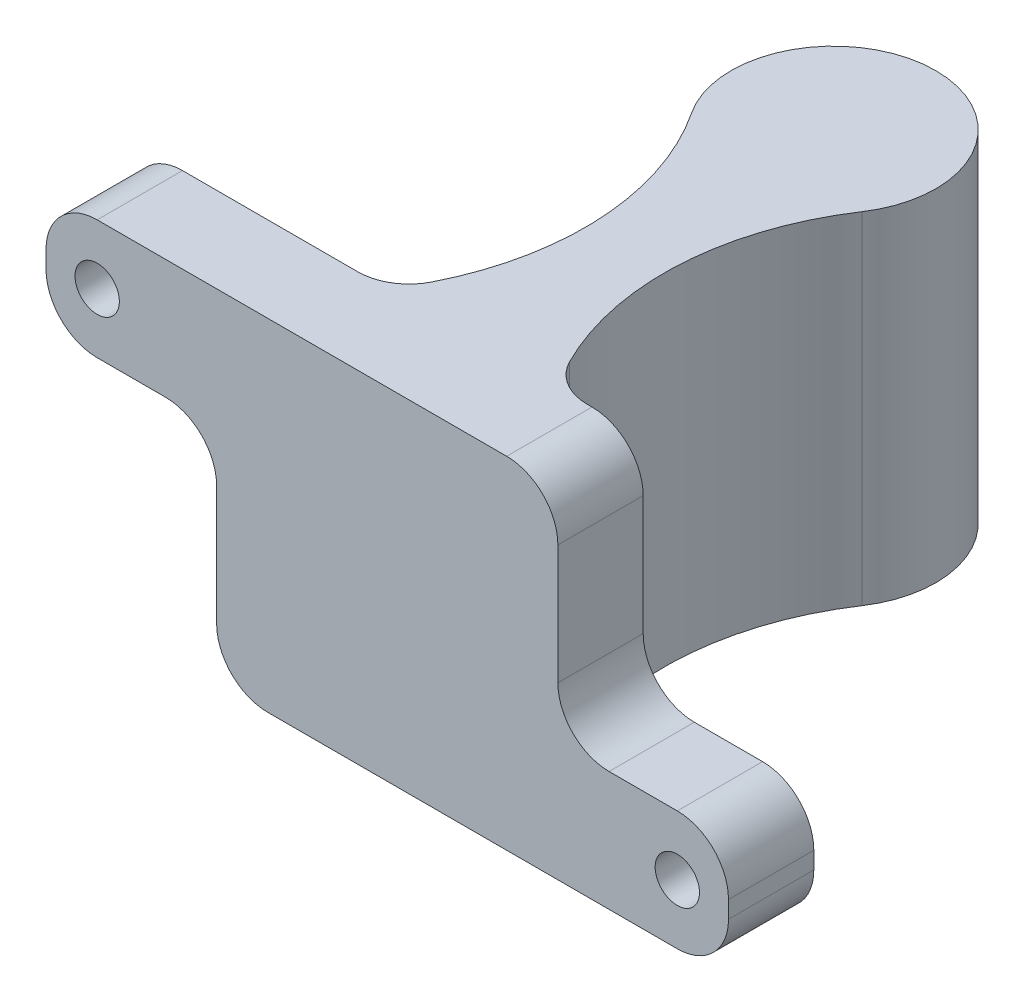
ISO-10303-21;
HEADER;
FILE_DESCRIPTION(('STEP AP214'),'2;1');
FILE_NAME('part.step','',(''),(''),'','','');
FILE_SCHEMA(('AUTOMOTIVE_DESIGN { 1 0 10303 214 1 1 1 1 }'));
ENDSEC;
DATA;
#1=APPLICATION_CONTEXT('core data for automotive mechanical design processes');
#2=APPLICATION_PROTOCOL_DEFINITION('international standard','automotive_design',2000,#1);
#3=PRODUCT_CONTEXT('',#1,'mechanical');
#4=PRODUCT('Part','Part','',(#3));
#5=PRODUCT_RELATED_PRODUCT_CATEGORY('part','',(#4));
#6=PRODUCT_DEFINITION_FORMATION('','',#4);
#7=PRODUCT_DEFINITION_CONTEXT('part definition',#1,'design');
#8=PRODUCT_DEFINITION('design','',#6,#7);
#9=PRODUCT_DEFINITION_SHAPE('','',#8);
#10=(LENGTH_UNIT() NAMED_UNIT(*) SI_UNIT(.MILLI.,.METRE.));
#11=(NAMED_UNIT(*) PLANE_ANGLE_UNIT() SI_UNIT($,.RADIAN.));
#12=(NAMED_UNIT(*) SI_UNIT($,.STERADIAN.) SOLID_ANGLE_UNIT());
#13=UNCERTAINTY_MEASURE_WITH_UNIT(LENGTH_MEASURE(1.E-05),#10,'distance_accuracy_value','');
#14=(GEOMETRIC_REPRESENTATION_CONTEXT(3) GLOBAL_UNCERTAINTY_ASSIGNED_CONTEXT((#13)) GLOBAL_UNIT_ASSIGNED_CONTEXT((#10,
#11,#12)) REPRESENTATION_CONTEXT('',''));
#15=CARTESIAN_POINT('',(0.,0.,0.));
#16=DIRECTION('',(0.,0.,1.));
#17=DIRECTION('',(1.,0.,0.));
#18=AXIS2_PLACEMENT_3D('',#15,#16,#17);
#19=CARTESIAN_POINT('',(0.,5.,0.));
#20=DIRECTION('',(1.,0.,0.));
#21=DIRECTION('',(0.,0.,-1.));
#22=AXIS2_PLACEMENT_3D('',#19,#20,#21);
#23=PLANE('',#22);
#24=DIRECTION('',(0.,-1.,0.));
#25=VECTOR('',#24,1.);
#26=CARTESIAN_POINT('',(0.,25.,-5.));
#27=LINE('',#26,#25);
#28=CARTESIAN_POINT('',(0.,15.,-5.));
#29=VERTEX_POINT('',#28);
#30=CARTESIAN_POINT('',(0.,8.,-5.));
#31=VERTEX_POINT('',#30);
#32=EDGE_CURVE('E235',#29,#31,#27,.T.);
#33=ORIENTED_EDGE('',*,*,#32,.T.);
#34=DIRECTION('',(0.,0.,1.));
#35=VECTOR('',#34,1.);
#36=CARTESIAN_POINT('',(0.,8.,0.));
#37=LINE('',#36,#35);
#38=CARTESIAN_POINT('',(0.,8.,0.));
#39=VERTEX_POINT('',#38);
#40=EDGE_CURVE('E317',#31,#39,#37,.T.);
#41=ORIENTED_EDGE('',*,*,#40,.T.);
#42=DIRECTION('',(0.,-1.,0.));
#43=VECTOR('',#42,1.);
#44=CARTESIAN_POINT('',(0.,5.,0.));
#45=LINE('',#44,#43);
#46=CARTESIAN_POINT('',(0.,15.,0.));
#47=VERTEX_POINT('',#46);
#48=EDGE_CURVE('E250',#47,#39,#45,.T.);
#49=ORIENTED_EDGE('',*,*,#48,.F.);
#50=DIRECTION('',(0.,0.,1.));
#51=VECTOR('',#50,1.);
#52=CARTESIAN_POINT('',(0.,15.,0.));
#53=LINE('',#52,#51);
#54=EDGE_CURVE('E314',#47,#29,#53,.F.);
#55=ORIENTED_EDGE('',*,*,#54,.T.);
#56=EDGE_LOOP('',(#33,#41,#49,#55));
#57=FACE_BOUND('',#56,.T.);
#58=ADVANCED_FACE('F39',(#57),#23,.F.);
#59=CARTESIAN_POINT('',(20.,5.,0.));
#60=DIRECTION('',(-1.,0.,0.));
#61=DIRECTION('',(0.,0.,1.));
#62=AXIS2_PLACEMENT_3D('',#59,#60,#61);
#63=PLANE('',#62);
#64=DIRECTION('',(0.,-1.,0.));
#65=VECTOR('',#64,1.);
#66=CARTESIAN_POINT('',(20.,25.,-5.));
#67=LINE('',#66,#65);
#68=CARTESIAN_POINT('',(20.,22.,-5.));
#69=VERTEX_POINT('',#68);
#70=CARTESIAN_POINT('',(20.,15.,-5.));
#71=VERTEX_POINT('',#70);
#72=EDGE_CURVE('E242',#69,#71,#67,.T.);
#73=ORIENTED_EDGE('',*,*,#72,.F.);
#74=DIRECTION('',(0.,0.,-1.));
#75=VECTOR('',#74,1.);
#76=CARTESIAN_POINT('',(20.,22.,0.));
#77=LINE('',#76,#75);
#78=CARTESIAN_POINT('',(20.,22.,0.));
#79=VERTEX_POINT('',#78);
#80=EDGE_CURVE('E294',#69,#79,#77,.F.);
#81=ORIENTED_EDGE('',*,*,#80,.T.);
#82=DIRECTION('',(0.,-1.,0.));
#83=VECTOR('',#82,1.);
#84=CARTESIAN_POINT('',(20.,5.,0.));
#85=LINE('',#84,#83);
#86=CARTESIAN_POINT('',(20.,15.,0.));
#87=VERTEX_POINT('',#86);
#88=EDGE_CURVE('E246',#79,#87,#85,.T.);
#89=ORIENTED_EDGE('',*,*,#88,.T.);
#90=DIRECTION('',(0.,0.,1.));
#91=VECTOR('',#90,1.);
#92=CARTESIAN_POINT('',(20.,15.,0.));
#93=LINE('',#92,#91);
#94=EDGE_CURVE('E291',#87,#71,#93,.F.);
#95=ORIENTED_EDGE('',*,*,#94,.T.);
#96=EDGE_LOOP('',(#73,#81,#89,#95));
#97=FACE_BOUND('',#96,.T.);
#98=ADVANCED_FACE('F497',(#97),#63,.F.);
#99=CARTESIAN_POINT('',(10.,5.,-26.15));
#100=DIRECTION('',(0.,-1.,0.));
#101=DIRECTION('',(0.,0.,-1.));
#102=AXIS2_PLACEMENT_3D('',#99,#100,#101);
#103=CYLINDRICAL_SURFACE('',#102,3.3734375);
#104=CARTESIAN_POINT('',(10.,5.,-26.15));
#105=DIRECTION('',(0.,-1.,0.));
#106=DIRECTION('',(0.,0.,-1.));
#107=AXIS2_PLACEMENT_3D('',#104,#105,#106);
#108=CIRCLE('',#107,3.3734375);
#109=CARTESIAN_POINT('',(10.,5.,-29.5234375));
#110=VERTEX_POINT('',#109);
#111=EDGE_CURVE('E447',#110,#110,#108,.T.);
#112=ORIENTED_EDGE('',*,*,#111,.T.);
#113=EDGE_LOOP('',(#112));
#114=FACE_BOUND('',#113,.T.);
#115=CARTESIAN_POINT('',(10.,22.,-26.15));
#116=DIRECTION('',(0.,1.,0.));
#117=DIRECTION('',(0.,0.,1.));
#118=AXIS2_PLACEMENT_3D('',#115,#116,#117);
#119=CIRCLE('',#118,3.3734375);
#120=CARTESIAN_POINT('',(10.,22.,-22.7765625));
#121=VERTEX_POINT('',#120);
#122=EDGE_CURVE('E439',#121,#121,#119,.T.);
#123=ORIENTED_EDGE('',*,*,#122,.T.);
#124=EDGE_LOOP('',(#123));
#125=FACE_BOUND('',#124,.T.);
#126=ADVANCED_FACE('F502',(#114,#125),#103,.F.);
#127=CARTESIAN_POINT('',(0.,5.,0.));
#128=DIRECTION('',(0.,0.,-1.));
#129=DIRECTION('',(-1.,0.,0.));
#130=AXIS2_PLACEMENT_3D('',#127,#128,#129);
#131=PLANE('',#130);
#132=ORIENTED_EDGE('',*,*,#88,.F.);
#133=CARTESIAN_POINT('',(17.,22.,0.));
#134=DIRECTION('',(0.,0.,-1.));
#135=DIRECTION('',(-1.,0.,0.));
#136=AXIS2_PLACEMENT_3D('',#133,#134,#135);
#137=CIRCLE('',#136,3.);
#138=CARTESIAN_POINT('',(17.,25.,0.));
#139=VERTEX_POINT('',#138);
#140=EDGE_CURVE('E311',#79,#139,#137,.F.);
#141=ORIENTED_EDGE('',*,*,#140,.T.);
#142=DIRECTION('',(1.,0.,0.));
#143=VECTOR('',#142,1.);
#144=CARTESIAN_POINT('',(0.,25.,0.));
#145=LINE('',#144,#143);
#146=CARTESIAN_POINT('',(-7.,25.,0.));
#147=VERTEX_POINT('',#146);
#148=EDGE_CURVE('E227',#147,#139,#145,.T.);
#149=ORIENTED_EDGE('',*,*,#148,.F.);
#150=CARTESIAN_POINT('',(-7.,22.,0.));
#151=DIRECTION('',(0.,0.,-1.));
#152=DIRECTION('',(-1.,0.,0.));
#153=AXIS2_PLACEMENT_3D('',#150,#151,#152);
#154=CIRCLE('',#153,3.);
#155=CARTESIAN_POINT('',(-10.,22.,0.));
#156=VERTEX_POINT('',#155);
#157=EDGE_CURVE('E297',#147,#156,#154,.F.);
#158=ORIENTED_EDGE('',*,*,#157,.T.);
#159=DIRECTION('',(0.,-1.,0.));
#160=VECTOR('',#159,1.);
#161=CARTESIAN_POINT('',(-10.,25.,0.));
#162=LINE('',#161,#160);
#163=CARTESIAN_POINT('',(-10.,21.,0.));
#164=VERTEX_POINT('',#163);
#165=EDGE_CURVE('E392',#156,#164,#162,.T.);
#166=ORIENTED_EDGE('',*,*,#165,.T.);
#167=CARTESIAN_POINT('',(-7.,21.,0.));
#168=DIRECTION('',(0.,0.,-1.));
#169=DIRECTION('',(-1.,0.,0.));
#170=AXIS2_PLACEMENT_3D('',#167,#168,#169);
#171=CIRCLE('',#170,3.);
#172=CARTESIAN_POINT('',(-7.,18.,0.));
#173=VERTEX_POINT('',#172);
#174=EDGE_CURVE('E300',#164,#173,#171,.F.);
#175=ORIENTED_EDGE('',*,*,#174,.T.);
#176=DIRECTION('',(1.,0.,0.));
#177=VECTOR('',#176,1.);
#178=CARTESIAN_POINT('',(-10.,18.,0.));
#179=LINE('',#178,#177);
#180=CARTESIAN_POINT('',(-3.,18.,0.));
#181=VERTEX_POINT('',#180);
#182=EDGE_CURVE('E399',#173,#181,#179,.T.);
#183=ORIENTED_EDGE('',*,*,#182,.T.);
#184=CARTESIAN_POINT('',(-3.,15.,0.));
#185=DIRECTION('',(0.,0.,-1.));
#186=DIRECTION('',(-1.,0.,0.));
#187=AXIS2_PLACEMENT_3D('',#184,#185,#186);
#188=CIRCLE('',#187,3.);
#189=EDGE_CURVE('E48',#181,#47,#188,.T.);
#190=ORIENTED_EDGE('',*,*,#189,.T.);
#191=ORIENTED_EDGE('',*,*,#48,.T.);
#192=CARTESIAN_POINT('',(3.,8.,0.));
#193=DIRECTION('',(0.,0.,-1.));
#194=DIRECTION('',(-1.,0.,0.));
#195=AXIS2_PLACEMENT_3D('',#192,#193,#194);
#196=CIRCLE('',#195,3.);
#197=CARTESIAN_POINT('',(3.,5.,0.));
#198=VERTEX_POINT('',#197);
#199=EDGE_CURVE('E55',#39,#198,#196,.F.);
#200=ORIENTED_EDGE('',*,*,#199,.T.);
#201=DIRECTION('',(1.,0.,0.));
#202=VECTOR('',#201,1.);
#203=CARTESIAN_POINT('',(0.,5.,0.));
#204=LINE('',#203,#202);
#205=CARTESIAN_POINT('',(27.,5.,0.));
#206=VERTEX_POINT('',#205);
#207=EDGE_CURVE('E443',#198,#206,#204,.T.);
#208=ORIENTED_EDGE('',*,*,#207,.T.);
#209=CARTESIAN_POINT('',(27.,8.,0.));
#210=DIRECTION('',(0.,0.,-1.));
#211=DIRECTION('',(-1.,0.,0.));
#212=AXIS2_PLACEMENT_3D('',#209,#210,#211);
#213=CIRCLE('',#212,3.);
#214=CARTESIAN_POINT('',(30.,8.,0.));
#215=VERTEX_POINT('',#214);
#216=EDGE_CURVE('E306',#206,#215,#213,.F.);
#217=ORIENTED_EDGE('',*,*,#216,.T.);
#218=DIRECTION('',(0.,1.,0.));
#219=VECTOR('',#218,1.);
#220=CARTESIAN_POINT('',(30.,5.,0.));
#221=LINE('',#220,#219);
#222=CARTESIAN_POINT('',(30.,9.,0.));
#223=VERTEX_POINT('',#222);
#224=EDGE_CURVE('E429',#215,#223,#221,.T.);
#225=ORIENTED_EDGE('',*,*,#224,.T.);
#226=CARTESIAN_POINT('',(27.,9.,0.));
#227=DIRECTION('',(0.,0.,-1.));
#228=DIRECTION('',(-1.,0.,0.));
#229=AXIS2_PLACEMENT_3D('',#226,#227,#228);
#230=CIRCLE('',#229,3.);
#231=CARTESIAN_POINT('',(27.,12.,0.));
#232=VERTEX_POINT('',#231);
#233=EDGE_CURVE('E303',#223,#232,#230,.F.);
#234=ORIENTED_EDGE('',*,*,#233,.T.);
#235=DIRECTION('',(-1.,0.,0.));
#236=VECTOR('',#235,1.);
#237=CARTESIAN_POINT('',(30.,12.,0.));
#238=LINE('',#237,#236);
#239=CARTESIAN_POINT('',(23.,12.,0.));
#240=VERTEX_POINT('',#239);
#241=EDGE_CURVE('E421',#232,#240,#238,.T.);
#242=ORIENTED_EDGE('',*,*,#241,.T.);
#243=CARTESIAN_POINT('',(23.,15.,0.));
#244=DIRECTION('',(0.,0.,-1.));
#245=DIRECTION('',(-1.,0.,0.));
#246=AXIS2_PLACEMENT_3D('',#243,#244,#245);
#247=CIRCLE('',#246,3.);
#248=EDGE_CURVE('E367',#240,#87,#247,.T.);
#249=ORIENTED_EDGE('',*,*,#248,.T.);
#250=EDGE_LOOP('',(#132,#141,#149,#158,#166,#175,#183,#190,#191,#200,#208,#217,#225,#234,#242,#249));
#251=FACE_BOUND('',#250,.T.);
#252=CARTESIAN_POINT('',(27.,8.5,0.));
#253=DIRECTION('',(0.,0.,1.));
#254=DIRECTION('',(1.,0.,0.));
#255=AXIS2_PLACEMENT_3D('',#252,#253,#254);
#256=CIRCLE('',#255,1.3);
#257=CARTESIAN_POINT('',(28.3,8.5,0.));
#258=VERTEX_POINT('',#257);
#259=EDGE_CURVE('E414',#258,#258,#256,.T.);
#260=ORIENTED_EDGE('',*,*,#259,.F.);
#261=EDGE_LOOP('',(#260));
#262=FACE_BOUND('',#261,.T.);
#263=CARTESIAN_POINT('',(-7.,21.5,0.));
#264=DIRECTION('',(0.,0.,1.));
#265=DIRECTION('',(1.,0.,0.));
#266=AXIS2_PLACEMENT_3D('',#263,#264,#265);
#267=CIRCLE('',#266,1.3);
#268=CARTESIAN_POINT('',(-5.7,21.5,0.));
#269=VERTEX_POINT('',#268);
#270=EDGE_CURVE('E400',#269,#269,#267,.T.);
#271=ORIENTED_EDGE('',*,*,#270,.F.);
#272=EDGE_LOOP('',(#271));
#273=FACE_BOUND('',#272,.T.);
#274=ADVANCED_FACE('F390',(#251,#262,#273),#131,.F.);
#275=CARTESIAN_POINT('',(0.,25.,-5.));
#276=DIRECTION('',(0.,0.,1.));
#277=DIRECTION('',(1.,0.,0.));
#278=AXIS2_PLACEMENT_3D('',#275,#276,#277);
#279=PLANE('',#278);
#280=DIRECTION('',(-1.,0.,0.));
#281=VECTOR('',#280,1.);
#282=CARTESIAN_POINT('',(0.,25.,-5.));
#283=LINE('',#282,#281);
#284=CARTESIAN_POINT('',(3.27992557879477,25.,-5.));
#285=VERTEX_POINT('',#284);
#286=CARTESIAN_POINT('',(-7.,25.,-5.));
#287=VERTEX_POINT('',#286);
#288=EDGE_CURVE('E231',#285,#287,#283,.T.);
#289=ORIENTED_EDGE('',*,*,#288,.F.);
#290=DIRECTION('',(0.,1.,0.));
#291=VECTOR('',#290,1.);
#292=CARTESIAN_POINT('',(3.27992557879477,5.,-5.));
#293=LINE('',#292,#291);
#294=CARTESIAN_POINT('',(3.27992557879477,5.,-5.));
#295=VERTEX_POINT('',#294);
#296=EDGE_CURVE('E262',#285,#295,#293,.F.);
#297=ORIENTED_EDGE('',*,*,#296,.T.);
#298=DIRECTION('',(-1.,0.,0.));
#299=VECTOR('',#298,1.);
#300=CARTESIAN_POINT('',(0.,5.,-5.));
#301=LINE('',#300,#299);
#302=CARTESIAN_POINT('',(3.,5.,-5.));
#303=VERTEX_POINT('',#302);
#304=EDGE_CURVE('E217',#295,#303,#301,.T.);
#305=ORIENTED_EDGE('',*,*,#304,.T.);
#306=CARTESIAN_POINT('',(3.,8.,-5.));
#307=DIRECTION('',(0.,0.,1.));
#308=DIRECTION('',(1.,0.,0.));
#309=AXIS2_PLACEMENT_3D('',#306,#307,#308);
#310=CIRCLE('',#309,3.);
#311=EDGE_CURVE('E259',#303,#31,#310,.F.);
#312=ORIENTED_EDGE('',*,*,#311,.T.);
#313=ORIENTED_EDGE('',*,*,#32,.F.);
#314=CARTESIAN_POINT('',(-3.,15.,-5.));
#315=DIRECTION('',(0.,0.,1.));
#316=DIRECTION('',(1.,0.,0.));
#317=AXIS2_PLACEMENT_3D('',#314,#315,#316);
#318=CIRCLE('',#317,3.);
#319=CARTESIAN_POINT('',(-3.,18.,-5.));
#320=VERTEX_POINT('',#319);
#321=EDGE_CURVE('E11',#29,#320,#318,.T.);
#322=ORIENTED_EDGE('',*,*,#321,.T.);
#323=DIRECTION('',(-1.,0.,0.));
#324=VECTOR('',#323,1.);
#325=CARTESIAN_POINT('',(-10.,18.,-5.));
#326=LINE('',#325,#324);
#327=CARTESIAN_POINT('',(-7.,18.,-5.));
#328=VERTEX_POINT('',#327);
#329=EDGE_CURVE('E415',#320,#328,#326,.T.);
#330=ORIENTED_EDGE('',*,*,#329,.T.);
#331=CARTESIAN_POINT('',(-7.,21.,-5.));
#332=DIRECTION('',(0.,0.,1.));
#333=DIRECTION('',(1.,0.,0.));
#334=AXIS2_PLACEMENT_3D('',#331,#332,#333);
#335=CIRCLE('',#334,3.);
#336=CARTESIAN_POINT('',(-10.,21.,-5.));
#337=VERTEX_POINT('',#336);
#338=EDGE_CURVE('E256',#328,#337,#335,.F.);
#339=ORIENTED_EDGE('',*,*,#338,.T.);
#340=DIRECTION('',(0.,1.,0.));
#341=VECTOR('',#340,1.);
#342=CARTESIAN_POINT('',(-10.,25.,-5.));
#343=LINE('',#342,#341);
#344=CARTESIAN_POINT('',(-10.,22.,-5.));
#345=VERTEX_POINT('',#344);
#346=EDGE_CURVE('E404',#337,#345,#343,.T.);
#347=ORIENTED_EDGE('',*,*,#346,.T.);
#348=CARTESIAN_POINT('',(-7.,22.,-5.));
#349=DIRECTION('',(0.,0.,1.));
#350=DIRECTION('',(1.,0.,0.));
#351=AXIS2_PLACEMENT_3D('',#348,#349,#350);
#352=CIRCLE('',#351,3.);
#353=EDGE_CURVE('E253',#345,#287,#352,.F.);
#354=ORIENTED_EDGE('',*,*,#353,.T.);
#355=EDGE_LOOP('',(#289,#297,#305,#312,#313,#322,#330,#339,#347,#354));
#356=FACE_BOUND('',#355,.T.);
#357=CARTESIAN_POINT('',(-7.,21.5,-5.));
#358=DIRECTION('',(0.,0.,1.));
#359=DIRECTION('',(1.,0.,0.));
#360=AXIS2_PLACEMENT_3D('',#357,#358,#359);
#361=CIRCLE('',#360,1.3);
#362=CARTESIAN_POINT('',(-5.7,21.5,-5.));
#363=VERTEX_POINT('',#362);
#364=EDGE_CURVE('E410',#363,#363,#361,.F.);
#365=ORIENTED_EDGE('',*,*,#364,.F.);
#366=EDGE_LOOP('',(#365));
#367=FACE_BOUND('',#366,.T.);
#368=ADVANCED_FACE('F466',(#356,#367),#279,.F.);
#369=CARTESIAN_POINT('',(27.,5.,-5.));
#370=VERTEX_POINT('',#369);
#371=CARTESIAN_POINT('',(16.7200744212052,5.,-5.));
#372=VERTEX_POINT('',#371);
#373=EDGE_CURVE('E223',#370,#372,#301,.T.);
#374=ORIENTED_EDGE('',*,*,#373,.T.);
#375=DIRECTION('',(0.,1.,0.));
#376=VECTOR('',#375,1.);
#377=CARTESIAN_POINT('',(16.7200744212052,25.,-5.));
#378=LINE('',#377,#376);
#379=CARTESIAN_POINT('',(16.7200744212052,25.,-5.));
#380=VERTEX_POINT('',#379);
#381=EDGE_CURVE('E280',#372,#380,#378,.T.);
#382=ORIENTED_EDGE('',*,*,#381,.T.);
#383=CARTESIAN_POINT('',(17.,25.,-5.));
#384=VERTEX_POINT('',#383);
#385=EDGE_CURVE('E232',#384,#380,#283,.T.);
#386=ORIENTED_EDGE('',*,*,#385,.F.);
#387=CARTESIAN_POINT('',(17.,22.,-5.));
#388=DIRECTION('',(0.,0.,1.));
#389=DIRECTION('',(1.,0.,0.));
#390=AXIS2_PLACEMENT_3D('',#387,#388,#389);
#391=CIRCLE('',#390,3.);
#392=EDGE_CURVE('E277',#384,#69,#391,.F.);
#393=ORIENTED_EDGE('',*,*,#392,.T.);
#394=ORIENTED_EDGE('',*,*,#72,.T.);
#395=CARTESIAN_POINT('',(23.,15.,-5.));
#396=DIRECTION('',(0.,0.,1.));
#397=DIRECTION('',(1.,0.,0.));
#398=AXIS2_PLACEMENT_3D('',#395,#396,#397);
#399=CIRCLE('',#398,3.);
#400=CARTESIAN_POINT('',(23.,12.,-5.));
#401=VERTEX_POINT('',#400);
#402=EDGE_CURVE('E370',#71,#401,#399,.T.);
#403=ORIENTED_EDGE('',*,*,#402,.T.);
#404=DIRECTION('',(1.,0.,0.));
#405=VECTOR('',#404,1.);
#406=CARTESIAN_POINT('',(30.,12.,-5.));
#407=LINE('',#406,#405);
#408=CARTESIAN_POINT('',(27.,12.,-5.));
#409=VERTEX_POINT('',#408);
#410=EDGE_CURVE('E420',#401,#409,#407,.T.);
#411=ORIENTED_EDGE('',*,*,#410,.T.);
#412=CARTESIAN_POINT('',(27.,9.,-5.));
#413=DIRECTION('',(0.,0.,1.));
#414=DIRECTION('',(1.,0.,0.));
#415=AXIS2_PLACEMENT_3D('',#412,#413,#414);
#416=CIRCLE('',#415,3.);
#417=CARTESIAN_POINT('',(30.,9.,-5.));
#418=VERTEX_POINT('',#417);
#419=EDGE_CURVE('E271',#409,#418,#416,.F.);
#420=ORIENTED_EDGE('',*,*,#419,.T.);
#421=DIRECTION('',(0.,-1.,0.));
#422=VECTOR('',#421,1.);
#423=CARTESIAN_POINT('',(30.,5.,-5.));
#424=LINE('',#423,#422);
#425=CARTESIAN_POINT('',(30.,8.,-5.));
#426=VERTEX_POINT('',#425);
#427=EDGE_CURVE('E416',#418,#426,#424,.T.);
#428=ORIENTED_EDGE('',*,*,#427,.T.);
#429=CARTESIAN_POINT('',(27.,8.,-5.));
#430=DIRECTION('',(0.,0.,1.));
#431=DIRECTION('',(1.,0.,0.));
#432=AXIS2_PLACEMENT_3D('',#429,#430,#431);
#433=CIRCLE('',#432,3.);
#434=EDGE_CURVE('E274',#426,#370,#433,.F.);
#435=ORIENTED_EDGE('',*,*,#434,.T.);
#436=EDGE_LOOP('',(#374,#382,#386,#393,#394,#403,#411,#420,#428,#435));
#437=FACE_BOUND('',#436,.T.);
#438=CARTESIAN_POINT('',(27.,8.5,-5.));
#439=DIRECTION('',(0.,0.,1.));
#440=DIRECTION('',(1.,0.,0.));
#441=AXIS2_PLACEMENT_3D('',#438,#439,#440);
#442=CIRCLE('',#441,1.3);
#443=CARTESIAN_POINT('',(28.3,8.5,-5.));
#444=VERTEX_POINT('',#443);
#445=EDGE_CURVE('E425',#444,#444,#442,.F.);
#446=ORIENTED_EDGE('',*,*,#445,.F.);
#447=EDGE_LOOP('',(#446));
#448=FACE_BOUND('',#447,.T.);
#449=ADVANCED_FACE('F537',(#437,#448),#279,.F.);
#450=CARTESIAN_POINT('',(0.,25.,0.));
#451=DIRECTION('',(0.,-1.,0.));
#452=DIRECTION('',(0.,0.,-1.));
#453=AXIS2_PLACEMENT_3D('',#450,#451,#452);
#454=PLANE('',#453);
#455=ORIENTED_EDGE('',*,*,#148,.T.);
#456=DIRECTION('',(0.,0.,-1.));
#457=VECTOR('',#456,1.);
#458=CARTESIAN_POINT('',(17.,25.,0.));
#459=LINE('',#458,#457);
#460=EDGE_CURVE('E287',#139,#384,#459,.T.);
#461=ORIENTED_EDGE('',*,*,#460,.T.);
#462=ORIENTED_EDGE('',*,*,#385,.T.);
#463=CARTESIAN_POINT('',(16.7200744212052,25.,-8.));
#464=DIRECTION('',(0.,-1.,0.));
#465=DIRECTION('',(0.,0.,-1.));
#466=AXIS2_PLACEMENT_3D('',#463,#464,#465);
#467=CIRCLE('',#466,3.);
#468=CARTESIAN_POINT('',(14.0418857471184,25.,-6.64822138425226));
#469=VERTEX_POINT('',#468);
#470=EDGE_CURVE('E364',#380,#469,#467,.T.);
#471=ORIENTED_EDGE('',*,*,#470,.T.);
#472=CARTESIAN_POINT('',(28.4424123445493,25.,-13.9166876048223));
#473=DIRECTION('',(0.,-1.,0.));
#474=DIRECTION('',(0.,0.,1.));
#475=AXIS2_PLACEMENT_3D('',#472,#473,#474);
#476=CIRCLE('',#475,16.1308948134591);
#477=CARTESIAN_POINT('',(15.,25.,-22.8333752096446));
#478=VERTEX_POINT('',#477);
#479=EDGE_CURVE('E453',#469,#478,#476,.T.);
#480=ORIENTED_EDGE('',*,*,#479,.T.);
#481=CARTESIAN_POINT('',(10.,25.,-26.15));
#482=DIRECTION('',(0.,1.,0.));
#483=DIRECTION('',(0.,0.,1.));
#484=AXIS2_PLACEMENT_3D('',#481,#482,#483);
#485=CIRCLE('',#484,6.);
#486=CARTESIAN_POINT('',(5.,25.,-22.8333752096446));
#487=VERTEX_POINT('',#486);
#488=EDGE_CURVE('E215',#478,#487,#485,.T.);
#489=ORIENTED_EDGE('',*,*,#488,.T.);
#490=CARTESIAN_POINT('',(-8.44241234454926,25.,-13.9166876048223));
#491=DIRECTION('',(0.,-1.,0.));
#492=DIRECTION('',(0.,0.,-1.));
#493=AXIS2_PLACEMENT_3D('',#490,#491,#492);
#494=CIRCLE('',#493,16.1308948134591);
#495=CARTESIAN_POINT('',(5.95811425288163,25.,-6.64822138425227));
#496=VERTEX_POINT('',#495);
#497=EDGE_CURVE('E212',#487,#496,#494,.T.);
#498=ORIENTED_EDGE('',*,*,#497,.T.);
#499=CARTESIAN_POINT('',(3.27992557879477,25.,-8.));
#500=DIRECTION('',(0.,-1.,0.));
#501=DIRECTION('',(0.,0.,-1.));
#502=AXIS2_PLACEMENT_3D('',#499,#500,#501);
#503=CIRCLE('',#502,3.);
#504=EDGE_CURVE('E358',#496,#285,#503,.T.);
#505=ORIENTED_EDGE('',*,*,#504,.T.);
#506=ORIENTED_EDGE('',*,*,#288,.T.);
#507=DIRECTION('',(0.,0.,1.));
#508=VECTOR('',#507,1.);
#509=CARTESIAN_POINT('',(-7.,25.,0.));
#510=LINE('',#509,#508);
#511=EDGE_CURVE('E283',#287,#147,#510,.T.);
#512=ORIENTED_EDGE('',*,*,#511,.T.);
#513=EDGE_LOOP('',(#455,#461,#462,#471,#480,#489,#498,#505,#506,#512));
#514=FACE_BOUND('',#513,.T.);
#515=ADVANCED_FACE('F378',(#514),#454,.F.);
#516=CARTESIAN_POINT('',(-8.44241234454926,25.,-13.9166876048223));
#517=DIRECTION('',(0.,-1.,0.));
#518=DIRECTION('',(0.,0.,-1.));
#519=AXIS2_PLACEMENT_3D('',#516,#517,#518);
#520=CYLINDRICAL_SURFACE('',#519,16.1308948134591);
#521=CARTESIAN_POINT('',(-8.44241234454926,5.,-13.9166876048223));
#522=DIRECTION('',(0.,-1.,0.));
#523=DIRECTION('',(0.,0.,-1.));
#524=AXIS2_PLACEMENT_3D('',#521,#522,#523);
#525=CIRCLE('',#524,16.1308948134591);
#526=CARTESIAN_POINT('',(5.,5.,-22.8333752096446));
#527=VERTEX_POINT('',#526);
#528=CARTESIAN_POINT('',(5.95811425288163,5.,-6.64822138425227));
#529=VERTEX_POINT('',#528);
#530=EDGE_CURVE('E202',#527,#529,#525,.T.);
#531=ORIENTED_EDGE('',*,*,#530,.T.);
#532=DIRECTION('',(0.,-1.,0.));
#533=VECTOR('',#532,1.);
#534=CARTESIAN_POINT('',(5.95811425288163,25.,-6.64822138425226));
#535=LINE('',#534,#533);
#536=EDGE_CURVE('E266',#529,#496,#535,.F.);
#537=ORIENTED_EDGE('',*,*,#536,.T.);
#538=ORIENTED_EDGE('',*,*,#497,.F.);
#539=DIRECTION('',(0.,-1.,0.));
#540=VECTOR('',#539,1.);
#541=CARTESIAN_POINT('',(5.,25.,-22.8333752096446));
#542=LINE('',#541,#540);
#543=EDGE_CURVE('E218',#487,#527,#542,.T.);
#544=ORIENTED_EDGE('',*,*,#543,.T.);
#545=EDGE_LOOP('',(#531,#537,#538,#544));
#546=FACE_BOUND('',#545,.T.);
#547=ADVANCED_FACE('F461',(#546),#520,.F.);
#548=CARTESIAN_POINT('',(28.4424123445493,25.,-13.9166876048223));
#549=DIRECTION('',(0.,-1.,0.));
#550=DIRECTION('',(0.,0.,-1.));
#551=AXIS2_PLACEMENT_3D('',#548,#549,#550);
#552=CYLINDRICAL_SURFACE('',#551,16.1308948134591);
#553=ORIENTED_EDGE('',*,*,#479,.F.);
#554=DIRECTION('',(0.,-1.,0.));
#555=VECTOR('',#554,1.);
#556=CARTESIAN_POINT('',(14.0418857471184,25.,-6.64822138425226));
#557=LINE('',#556,#555);
#558=CARTESIAN_POINT('',(14.0418857471184,5.,-6.64822138425226));
#559=VERTEX_POINT('',#558);
#560=EDGE_CURVE('E198',#469,#559,#557,.T.);
#561=ORIENTED_EDGE('',*,*,#560,.T.);
#562=CARTESIAN_POINT('',(28.4424123445493,5.,-13.9166876048223));
#563=DIRECTION('',(0.,-1.,0.));
#564=DIRECTION('',(0.,0.,1.));
#565=AXIS2_PLACEMENT_3D('',#562,#563,#564);
#566=CIRCLE('',#565,16.1308948134591);
#567=CARTESIAN_POINT('',(15.,5.,-22.8333752096446));
#568=VERTEX_POINT('',#567);
#569=EDGE_CURVE('E190',#559,#568,#566,.T.);
#570=ORIENTED_EDGE('',*,*,#569,.T.);
#571=DIRECTION('',(0.,-1.,0.));
#572=VECTOR('',#571,1.);
#573=CARTESIAN_POINT('',(15.,25.,-22.8333752096446));
#574=LINE('',#573,#572);
#575=EDGE_CURVE('E195',#478,#568,#574,.T.);
#576=ORIENTED_EDGE('',*,*,#575,.F.);
#577=EDGE_LOOP('',(#553,#561,#570,#576));
#578=FACE_BOUND('',#577,.T.);
#579=ADVANCED_FACE('F193',(#578),#552,.F.);
#580=CARTESIAN_POINT('',(10.,25.,-26.15));
#581=DIRECTION('',(0.,-1.,0.));
#582=DIRECTION('',(0.,0.,-1.));
#583=AXIS2_PLACEMENT_3D('',#580,#581,#582);
#584=CYLINDRICAL_SURFACE('',#583,6.);
#585=CARTESIAN_POINT('',(10.,5.,-26.15));
#586=DIRECTION('',(0.,1.,0.));
#587=DIRECTION('',(0.,0.,1.));
#588=AXIS2_PLACEMENT_3D('',#585,#586,#587);
#589=CIRCLE('',#588,6.);
#590=EDGE_CURVE('E201',#568,#527,#589,.T.);
#591=ORIENTED_EDGE('',*,*,#590,.T.);
#592=ORIENTED_EDGE('',*,*,#543,.F.);
#593=ORIENTED_EDGE('',*,*,#488,.F.);
#594=ORIENTED_EDGE('',*,*,#575,.T.);
#595=EDGE_LOOP('',(#591,#592,#593,#594));
#596=FACE_BOUND('',#595,.T.);
#597=ADVANCED_FACE('F214',(#596),#584,.T.);
#598=CARTESIAN_POINT('',(0.,5.,0.));
#599=DIRECTION('',(0.,-1.,0.));
#600=DIRECTION('',(0.,0.,-1.));
#601=AXIS2_PLACEMENT_3D('',#598,#599,#600);
#602=PLANE('',#601);
#603=ORIENTED_EDGE('',*,*,#111,.F.);
#604=EDGE_LOOP('',(#603));
#605=FACE_BOUND('',#604,.T.);
#606=ORIENTED_EDGE('',*,*,#207,.F.);
#607=DIRECTION('',(0.,0.,1.));
#608=VECTOR('',#607,1.);
#609=CARTESIAN_POINT('',(3.,5.,-5.));
#610=LINE('',#609,#608);
#611=EDGE_CURVE('E324',#198,#303,#610,.F.);
#612=ORIENTED_EDGE('',*,*,#611,.T.);
#613=ORIENTED_EDGE('',*,*,#304,.F.);
#614=CARTESIAN_POINT('',(3.27992557879477,5.,-8.));
#615=DIRECTION('',(0.,-1.,0.));
#616=DIRECTION('',(0.,0.,-1.));
#617=AXIS2_PLACEMENT_3D('',#614,#615,#616);
#618=CIRCLE('',#617,3.);
#619=EDGE_CURVE('E355',#295,#529,#618,.F.);
#620=ORIENTED_EDGE('',*,*,#619,.T.);
#621=ORIENTED_EDGE('',*,*,#530,.F.);
#622=ORIENTED_EDGE('',*,*,#590,.F.);
#623=ORIENTED_EDGE('',*,*,#569,.F.);
#624=CARTESIAN_POINT('',(16.7200744212052,5.,-8.));
#625=DIRECTION('',(0.,-1.,0.));
#626=DIRECTION('',(0.,0.,-1.));
#627=AXIS2_PLACEMENT_3D('',#624,#625,#626);
#628=CIRCLE('',#627,3.);
#629=EDGE_CURVE('E361',#559,#372,#628,.F.);
#630=ORIENTED_EDGE('',*,*,#629,.T.);
#631=ORIENTED_EDGE('',*,*,#373,.F.);
#632=DIRECTION('',(0.,0.,1.));
#633=VECTOR('',#632,1.);
#634=CARTESIAN_POINT('',(27.,5.,0.));
#635=LINE('',#634,#633);
#636=EDGE_CURVE('E320',#370,#206,#635,.T.);
#637=ORIENTED_EDGE('',*,*,#636,.T.);
#638=EDGE_LOOP('',(#606,#612,#613,#620,#621,#622,#623,#630,#631,#637));
#639=FACE_BOUND('',#638,.T.);
#640=ADVANCED_FACE('F206',(#605,#639),#602,.T.);
#641=CARTESIAN_POINT('',(10.,22.,-26.15));
#642=DIRECTION('',(0.,1.,0.));
#643=DIRECTION('',(0.,0.,1.));
#644=AXIS2_PLACEMENT_3D('',#641,#642,#643);
#645=PLANE('',#644);
#646=ORIENTED_EDGE('',*,*,#122,.F.);
#647=EDGE_LOOP('',(#646));
#648=FACE_BOUND('',#647,.T.);
#649=ADVANCED_FACE('F561',(#648),#645,.F.);
#650=CARTESIAN_POINT('',(30.,5.,-17.2065556157337));
#651=DIRECTION('',(1.,0.,0.));
#652=DIRECTION('',(0.,0.,-1.));
#653=AXIS2_PLACEMENT_3D('',#650,#651,#652);
#654=PLANE('',#653);
#655=ORIENTED_EDGE('',*,*,#224,.F.);
#656=DIRECTION('',(0.,0.,1.));
#657=VECTOR('',#656,1.);
#658=CARTESIAN_POINT('',(30.,8.,-17.2065556157337));
#659=LINE('',#658,#657);
#660=EDGE_CURVE('E331',#215,#426,#659,.F.);
#661=ORIENTED_EDGE('',*,*,#660,.T.);
#662=ORIENTED_EDGE('',*,*,#427,.F.);
#663=DIRECTION('',(0.,0.,1.));
#664=VECTOR('',#663,1.);
#665=CARTESIAN_POINT('',(30.,9.,-17.2065556157337));
#666=LINE('',#665,#664);
#667=EDGE_CURVE('E327',#418,#223,#666,.T.);
#668=ORIENTED_EDGE('',*,*,#667,.T.);
#669=EDGE_LOOP('',(#655,#661,#662,#668));
#670=FACE_BOUND('',#669,.T.);
#671=ADVANCED_FACE('F550',(#670),#654,.T.);
#672=CARTESIAN_POINT('',(30.,12.,-17.2065556157337));
#673=DIRECTION('',(0.,1.,0.));
#674=DIRECTION('',(-1.,0.,0.));
#675=AXIS2_PLACEMENT_3D('',#672,#673,#674);
#676=PLANE('',#675);
#677=ORIENTED_EDGE('',*,*,#241,.F.);
#678=DIRECTION('',(0.,0.,1.));
#679=VECTOR('',#678,1.);
#680=CARTESIAN_POINT('',(27.,12.,-17.2065556157337));
#681=LINE('',#680,#679);
#682=EDGE_CURVE('E338',#232,#409,#681,.F.);
#683=ORIENTED_EDGE('',*,*,#682,.T.);
#684=ORIENTED_EDGE('',*,*,#410,.F.);
#685=DIRECTION('',(0.,0.,1.));
#686=VECTOR('',#685,1.);
#687=CARTESIAN_POINT('',(23.,12.,-17.2065556157337));
#688=LINE('',#687,#686);
#689=EDGE_CURVE('E334',#401,#240,#688,.T.);
#690=ORIENTED_EDGE('',*,*,#689,.T.);
#691=EDGE_LOOP('',(#677,#683,#684,#690));
#692=FACE_BOUND('',#691,.T.);
#693=ADVANCED_FACE('F543',(#692),#676,.T.);
#694=CARTESIAN_POINT('',(27.,8.5,-17.2065556157337));
#695=DIRECTION('',(0.,0.,1.));
#696=DIRECTION('',(1.,0.,0.));
#697=AXIS2_PLACEMENT_3D('',#694,#695,#696);
#698=CYLINDRICAL_SURFACE('',#697,1.3);
#699=ORIENTED_EDGE('',*,*,#445,.T.);
#700=EDGE_LOOP('',(#699));
#701=FACE_BOUND('',#700,.T.);
#702=ORIENTED_EDGE('',*,*,#259,.T.);
#703=EDGE_LOOP('',(#702));
#704=FACE_BOUND('',#703,.T.);
#705=ADVANCED_FACE('F567',(#701,#704),#698,.F.);
#706=CARTESIAN_POINT('',(-10.,25.,-17.2065556157337));
#707=DIRECTION('',(-1.,0.,0.));
#708=DIRECTION('',(0.,-1.,0.));
#709=AXIS2_PLACEMENT_3D('',#706,#707,#708);
#710=PLANE('',#709);
#711=ORIENTED_EDGE('',*,*,#346,.F.);
#712=DIRECTION('',(0.,0.,1.));
#713=VECTOR('',#712,1.);
#714=CARTESIAN_POINT('',(-10.,21.,-17.2065556157337));
#715=LINE('',#714,#713);
#716=EDGE_CURVE('E351',#337,#164,#715,.T.);
#717=ORIENTED_EDGE('',*,*,#716,.T.);
#718=ORIENTED_EDGE('',*,*,#165,.F.);
#719=DIRECTION('',(0.,0.,1.));
#720=VECTOR('',#719,1.);
#721=CARTESIAN_POINT('',(-10.,22.,-5.));
#722=LINE('',#721,#720);
#723=EDGE_CURVE('E348',#156,#345,#722,.F.);
#724=ORIENTED_EDGE('',*,*,#723,.T.);
#725=EDGE_LOOP('',(#711,#717,#718,#724));
#726=FACE_BOUND('',#725,.T.);
#727=ADVANCED_FACE('F395',(#726),#710,.T.);
#728=CARTESIAN_POINT('',(-10.,18.,-17.2065556157337));
#729=DIRECTION('',(0.,-1.,0.));
#730=DIRECTION('',(0.,0.,-1.));
#731=AXIS2_PLACEMENT_3D('',#728,#729,#730);
#732=PLANE('',#731);
#733=ORIENTED_EDGE('',*,*,#329,.F.);
#734=DIRECTION('',(0.,0.,1.));
#735=VECTOR('',#734,1.);
#736=CARTESIAN_POINT('',(-3.,18.,-17.2065556157337));
#737=LINE('',#736,#735);
#738=EDGE_CURVE('E344',#320,#181,#737,.T.);
#739=ORIENTED_EDGE('',*,*,#738,.T.);
#740=ORIENTED_EDGE('',*,*,#182,.F.);
#741=DIRECTION('',(0.,0.,1.));
#742=VECTOR('',#741,1.);
#743=CARTESIAN_POINT('',(-7.,18.,-17.2065556157337));
#744=LINE('',#743,#742);
#745=EDGE_CURVE('E341',#173,#328,#744,.F.);
#746=ORIENTED_EDGE('',*,*,#745,.T.);
#747=EDGE_LOOP('',(#733,#739,#740,#746));
#748=FACE_BOUND('',#747,.T.);
#749=ADVANCED_FACE('F481',(#748),#732,.T.);
#750=CARTESIAN_POINT('',(-7.,21.5,-17.2065556157337));
#751=DIRECTION('',(0.,0.,1.));
#752=DIRECTION('',(1.,0.,0.));
#753=AXIS2_PLACEMENT_3D('',#750,#751,#752);
#754=CYLINDRICAL_SURFACE('',#753,1.3);
#755=ORIENTED_EDGE('',*,*,#364,.T.);
#756=EDGE_LOOP('',(#755));
#757=FACE_BOUND('',#756,.T.);
#758=ORIENTED_EDGE('',*,*,#270,.T.);
#759=EDGE_LOOP('',(#758));
#760=FACE_BOUND('',#759,.T.);
#761=ADVANCED_FACE('F510',(#757,#760),#754,.F.);
#762=CARTESIAN_POINT('',(3.27992557879477,25.,-8.));
#763=DIRECTION('',(0.,-1.,0.));
#764=DIRECTION('',(0.,0.,-1.));
#765=AXIS2_PLACEMENT_3D('',#762,#763,#764);
#766=CYLINDRICAL_SURFACE('',#765,3.);
#767=ORIENTED_EDGE('',*,*,#504,.F.);
#768=ORIENTED_EDGE('',*,*,#536,.F.);
#769=ORIENTED_EDGE('',*,*,#619,.F.);
#770=ORIENTED_EDGE('',*,*,#296,.F.);
#771=EDGE_LOOP('',(#767,#768,#769,#770));
#772=FACE_BOUND('',#771,.T.);
#773=ADVANCED_FACE('F464',(#772),#766,.F.);
#774=CARTESIAN_POINT('',(16.7200744212052,25.,-8.));
#775=DIRECTION('',(0.,-1.,0.));
#776=DIRECTION('',(0.,0.,-1.));
#777=AXIS2_PLACEMENT_3D('',#774,#775,#776);
#778=CYLINDRICAL_SURFACE('',#777,3.);
#779=ORIENTED_EDGE('',*,*,#470,.F.);
#780=ORIENTED_EDGE('',*,*,#381,.F.);
#781=ORIENTED_EDGE('',*,*,#629,.F.);
#782=ORIENTED_EDGE('',*,*,#560,.F.);
#783=EDGE_LOOP('',(#779,#780,#781,#782));
#784=FACE_BOUND('',#783,.T.);
#785=ADVANCED_FACE('F509',(#784),#778,.F.);
#786=CARTESIAN_POINT('',(17.,22.,0.));
#787=DIRECTION('',(0.,0.,-1.));
#788=DIRECTION('',(-1.,0.,0.));
#789=AXIS2_PLACEMENT_3D('',#786,#787,#788);
#790=CYLINDRICAL_SURFACE('',#789,3.);
#791=ORIENTED_EDGE('',*,*,#140,.F.);
#792=ORIENTED_EDGE('',*,*,#80,.F.);
#793=ORIENTED_EDGE('',*,*,#392,.F.);
#794=ORIENTED_EDGE('',*,*,#460,.F.);
#795=EDGE_LOOP('',(#791,#792,#793,#794));
#796=FACE_BOUND('',#795,.T.);
#797=ADVANCED_FACE('F513',(#796),#790,.T.);
#798=CARTESIAN_POINT('',(3.,8.,0.));
#799=DIRECTION('',(0.,0.,-1.));
#800=DIRECTION('',(-1.,0.,0.));
#801=AXIS2_PLACEMENT_3D('',#798,#799,#800);
#802=CYLINDRICAL_SURFACE('',#801,3.);
#803=ORIENTED_EDGE('',*,*,#311,.F.);
#804=ORIENTED_EDGE('',*,*,#611,.F.);
#805=ORIENTED_EDGE('',*,*,#199,.F.);
#806=ORIENTED_EDGE('',*,*,#40,.F.);
#807=EDGE_LOOP('',(#803,#804,#805,#806));
#808=FACE_BOUND('',#807,.T.);
#809=ADVANCED_FACE('F469',(#808),#802,.T.);
#810=CARTESIAN_POINT('',(27.,8.,0.));
#811=DIRECTION('',(0.,0.,1.));
#812=DIRECTION('',(1.,0.,0.));
#813=AXIS2_PLACEMENT_3D('',#810,#811,#812);
#814=CYLINDRICAL_SURFACE('',#813,3.);
#815=ORIENTED_EDGE('',*,*,#434,.F.);
#816=ORIENTED_EDGE('',*,*,#660,.F.);
#817=ORIENTED_EDGE('',*,*,#216,.F.);
#818=ORIENTED_EDGE('',*,*,#636,.F.);
#819=EDGE_LOOP('',(#815,#816,#817,#818));
#820=FACE_BOUND('',#819,.T.);
#821=ADVANCED_FACE('F520',(#820),#814,.T.);
#822=CARTESIAN_POINT('',(27.,9.,-17.2065556157337));
#823=DIRECTION('',(0.,0.,1.));
#824=DIRECTION('',(1.,0.,0.));
#825=AXIS2_PLACEMENT_3D('',#822,#823,#824);
#826=CYLINDRICAL_SURFACE('',#825,3.);
#827=ORIENTED_EDGE('',*,*,#419,.F.);
#828=ORIENTED_EDGE('',*,*,#682,.F.);
#829=ORIENTED_EDGE('',*,*,#233,.F.);
#830=ORIENTED_EDGE('',*,*,#667,.F.);
#831=EDGE_LOOP('',(#827,#828,#829,#830));
#832=FACE_BOUND('',#831,.T.);
#833=ADVANCED_FACE('F523',(#832),#826,.T.);
#834=CARTESIAN_POINT('',(23.,15.,-17.2065556157337));
#835=DIRECTION('',(0.,0.,1.));
#836=DIRECTION('',(1.,0.,0.));
#837=AXIS2_PLACEMENT_3D('',#834,#835,#836);
#838=CYLINDRICAL_SURFACE('',#837,3.);
#839=ORIENTED_EDGE('',*,*,#402,.F.);
#840=ORIENTED_EDGE('',*,*,#94,.F.);
#841=ORIENTED_EDGE('',*,*,#248,.F.);
#842=ORIENTED_EDGE('',*,*,#689,.F.);
#843=EDGE_LOOP('',(#839,#840,#841,#842));
#844=FACE_BOUND('',#843,.T.);
#845=ADVANCED_FACE('F494',(#844),#838,.F.);
#846=CARTESIAN_POINT('',(-3.,15.,-17.2065556157337));
#847=DIRECTION('',(0.,0.,1.));
#848=DIRECTION('',(1.,0.,0.));
#849=AXIS2_PLACEMENT_3D('',#846,#847,#848);
#850=CYLINDRICAL_SURFACE('',#849,3.);
#851=ORIENTED_EDGE('',*,*,#321,.F.);
#852=ORIENTED_EDGE('',*,*,#54,.F.);
#853=ORIENTED_EDGE('',*,*,#189,.F.);
#854=ORIENTED_EDGE('',*,*,#738,.F.);
#855=EDGE_LOOP('',(#851,#852,#853,#854));
#856=FACE_BOUND('',#855,.T.);
#857=ADVANCED_FACE('F475',(#856),#850,.F.);
#858=CARTESIAN_POINT('',(-7.,21.,-17.2065556157337));
#859=DIRECTION('',(0.,0.,1.));
#860=DIRECTION('',(1.,0.,0.));
#861=AXIS2_PLACEMENT_3D('',#858,#859,#860);
#862=CYLINDRICAL_SURFACE('',#861,3.);
#863=ORIENTED_EDGE('',*,*,#338,.F.);
#864=ORIENTED_EDGE('',*,*,#745,.F.);
#865=ORIENTED_EDGE('',*,*,#174,.F.);
#866=ORIENTED_EDGE('',*,*,#716,.F.);
#867=EDGE_LOOP('',(#863,#864,#865,#866));
#868=FACE_BOUND('',#867,.T.);
#869=ADVANCED_FACE('F488',(#868),#862,.T.);
#870=CARTESIAN_POINT('',(-7.,22.,0.));
#871=DIRECTION('',(0.,0.,-1.));
#872=DIRECTION('',(-1.,0.,0.));
#873=AXIS2_PLACEMENT_3D('',#870,#871,#872);
#874=CYLINDRICAL_SURFACE('',#873,3.);
#875=ORIENTED_EDGE('',*,*,#353,.F.);
#876=ORIENTED_EDGE('',*,*,#723,.F.);
#877=ORIENTED_EDGE('',*,*,#157,.F.);
#878=ORIENTED_EDGE('',*,*,#511,.F.);
#879=EDGE_LOOP('',(#875,#876,#877,#878));
#880=FACE_BOUND('',#879,.T.);
#881=ADVANCED_FACE('F41',(#880),#874,.T.);
#882=CLOSED_SHELL('',(#58,#98,#126,#274,#368,#449,#515,#547,#579,#597,#640,#649,#671,#693,#705,
#727,#749,#761,#773,#785,#797,#809,#821,#833,#845,#857,#869,#881));
#883=MANIFOLD_SOLID_BREP('B2',#882);
#884=ADVANCED_BREP_SHAPE_REPRESENTATION('',(#18,#883),#14);
#885=SHAPE_DEFINITION_REPRESENTATION(#9,#884);
ENDSEC;
END-ISO-10303-21;
